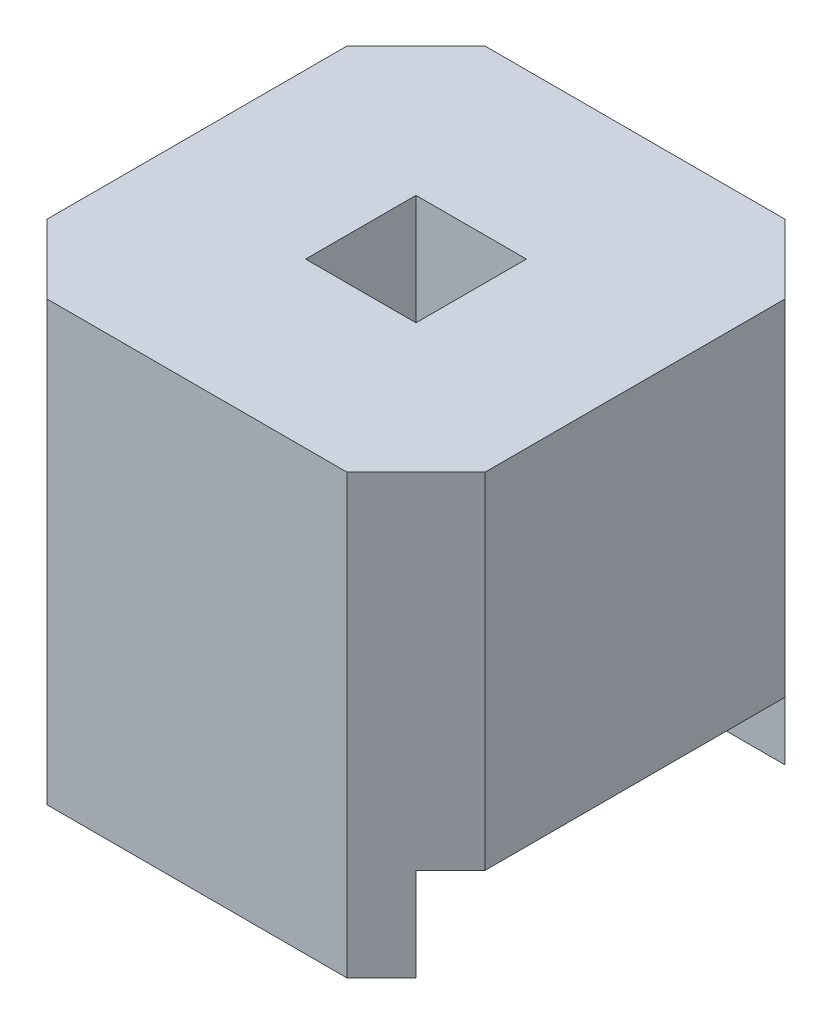
ISO-10303-21;
HEADER;
FILE_DESCRIPTION(('STEP AP214'),'2;1');
FILE_NAME('part.step','',(''),(''),'','','');
FILE_SCHEMA(('AUTOMOTIVE_DESIGN { 1 0 10303 214 1 1 1 1 }'));
ENDSEC;
DATA;
#1=APPLICATION_CONTEXT('core data for automotive mechanical design processes');
#2=APPLICATION_PROTOCOL_DEFINITION('international standard','automotive_design',2000,#1);
#3=PRODUCT_CONTEXT('',#1,'mechanical');
#4=PRODUCT('Part','Part','',(#3));
#5=PRODUCT_RELATED_PRODUCT_CATEGORY('part','',(#4));
#6=PRODUCT_DEFINITION_FORMATION('','',#4);
#7=PRODUCT_DEFINITION_CONTEXT('part definition',#1,'design');
#8=PRODUCT_DEFINITION('design','',#6,#7);
#9=PRODUCT_DEFINITION_SHAPE('','',#8);
#10=(LENGTH_UNIT() NAMED_UNIT(*) SI_UNIT(.MILLI.,.METRE.));
#11=(NAMED_UNIT(*) PLANE_ANGLE_UNIT() SI_UNIT($,.RADIAN.));
#12=(NAMED_UNIT(*) SI_UNIT($,.STERADIAN.) SOLID_ANGLE_UNIT());
#13=UNCERTAINTY_MEASURE_WITH_UNIT(LENGTH_MEASURE(1.E-05),#10,'distance_accuracy_value','');
#14=(GEOMETRIC_REPRESENTATION_CONTEXT(3) GLOBAL_UNCERTAINTY_ASSIGNED_CONTEXT((#13)) GLOBAL_UNIT_ASSIGNED_CONTEXT((#10,
#11,#12)) REPRESENTATION_CONTEXT('',''));
#15=CARTESIAN_POINT('',(0.,0.,0.));
#16=DIRECTION('',(0.,0.,1.));
#17=DIRECTION('',(1.,0.,0.));
#18=AXIS2_PLACEMENT_3D('',#15,#16,#17);
#19=CARTESIAN_POINT('',(-1.07,0.,-1.07));
#20=DIRECTION('',(0.,0.,-1.));
#21=DIRECTION('',(-1.,0.,0.));
#22=AXIS2_PLACEMENT_3D('',#19,#20,#21);
#23=PLANE('',#22);
#24=DIRECTION('',(1.,0.,0.));
#25=VECTOR('',#24,1.);
#26=CARTESIAN_POINT('',(0.,0.54,-1.07));
#27=LINE('',#26,#25);
#28=CARTESIAN_POINT('',(-1.07,0.54,-1.07));
#29=VERTEX_POINT('',#28);
#30=CARTESIAN_POINT('',(1.07,0.54,-1.07));
#31=VERTEX_POINT('',#30);
#32=EDGE_CURVE('E182',#29,#31,#27,.T.);
#33=ORIENTED_EDGE('',*,*,#32,.F.);
#34=DIRECTION('',(0.,1.,0.));
#35=VECTOR('',#34,1.);
#36=CARTESIAN_POINT('',(-1.07,1.27,-1.07));
#37=LINE('',#36,#35);
#38=CARTESIAN_POINT('',(-1.07,0.,-1.07));
#39=VERTEX_POINT('',#38);
#40=EDGE_CURVE('E173',#39,#29,#37,.T.);
#41=ORIENTED_EDGE('',*,*,#40,.F.);
#42=DIRECTION('',(1.,0.,0.));
#43=VECTOR('',#42,1.);
#44=CARTESIAN_POINT('',(0.,0.,-1.07));
#45=LINE('',#44,#43);
#46=CARTESIAN_POINT('',(1.07,0.,-1.07));
#47=VERTEX_POINT('',#46);
#48=EDGE_CURVE('E125',#39,#47,#45,.T.);
#49=ORIENTED_EDGE('',*,*,#48,.T.);
#50=DIRECTION('',(0.,1.,0.));
#51=VECTOR('',#50,1.);
#52=CARTESIAN_POINT('',(1.07,1.27,-1.07));
#53=LINE('',#52,#51);
#54=EDGE_CURVE('E148',#31,#47,#53,.F.);
#55=ORIENTED_EDGE('',*,*,#54,.F.);
#56=EDGE_LOOP('',(#33,#41,#49,#55));
#57=FACE_BOUND('',#56,.T.);
#58=ADVANCED_FACE('F17',(#57),#23,.F.);
#59=CARTESIAN_POINT('',(1.07,0.,1.07));
#60=DIRECTION('',(0.,0.,1.));
#61=DIRECTION('',(1.,0.,0.));
#62=AXIS2_PLACEMENT_3D('',#59,#60,#61);
#63=PLANE('',#62);
#64=DIRECTION('',(1.,0.,0.));
#65=VECTOR('',#64,1.);
#66=CARTESIAN_POINT('',(0.,0.54,1.07));
#67=LINE('',#66,#65);
#68=CARTESIAN_POINT('',(1.07,0.54,1.07));
#69=VERTEX_POINT('',#68);
#70=CARTESIAN_POINT('',(-1.07,0.54,1.07));
#71=VERTEX_POINT('',#70);
#72=EDGE_CURVE('E145',#69,#71,#67,.F.);
#73=ORIENTED_EDGE('',*,*,#72,.F.);
#74=DIRECTION('',(0.,1.,0.));
#75=VECTOR('',#74,1.);
#76=CARTESIAN_POINT('',(1.07,1.27,1.07));
#77=LINE('',#76,#75);
#78=CARTESIAN_POINT('',(1.07,0.,1.07));
#79=VERTEX_POINT('',#78);
#80=EDGE_CURVE('E142',#79,#69,#77,.T.);
#81=ORIENTED_EDGE('',*,*,#80,.F.);
#82=DIRECTION('',(1.,0.,0.));
#83=VECTOR('',#82,1.);
#84=CARTESIAN_POINT('',(0.,0.,1.07));
#85=LINE('',#84,#83);
#86=CARTESIAN_POINT('',(-1.07,0.,1.07));
#87=VERTEX_POINT('',#86);
#88=EDGE_CURVE('E130',#79,#87,#85,.F.);
#89=ORIENTED_EDGE('',*,*,#88,.T.);
#90=DIRECTION('',(0.,1.,0.));
#91=VECTOR('',#90,1.);
#92=CARTESIAN_POINT('',(-1.07,1.27,1.07));
#93=LINE('',#92,#91);
#94=EDGE_CURVE('E163',#71,#87,#93,.F.);
#95=ORIENTED_EDGE('',*,*,#94,.F.);
#96=EDGE_LOOP('',(#73,#81,#89,#95));
#97=FACE_BOUND('',#96,.T.);
#98=ADVANCED_FACE('F143',(#97),#63,.F.);
#99=CARTESIAN_POINT('',(0.32,2.54,0.32));
#100=DIRECTION('',(1.,0.,0.));
#101=DIRECTION('',(0.,0.,-1.));
#102=AXIS2_PLACEMENT_3D('',#99,#100,#101);
#103=PLANE('',#102);
#104=DIRECTION('',(0.,0.,-1.));
#105=VECTOR('',#104,1.);
#106=CARTESIAN_POINT('',(0.32,0.54,0.));
#107=LINE('',#106,#105);
#108=CARTESIAN_POINT('',(0.32,0.54,0.32));
#109=VERTEX_POINT('',#108);
#110=CARTESIAN_POINT('',(0.32,0.54,-0.32));
#111=VERTEX_POINT('',#110);
#112=EDGE_CURVE('E194',#109,#111,#107,.T.);
#113=ORIENTED_EDGE('',*,*,#112,.F.);
#114=DIRECTION('',(0.,1.,0.));
#115=VECTOR('',#114,1.);
#116=CARTESIAN_POINT('',(0.32,2.54,0.32));
#117=LINE('',#116,#115);
#118=CARTESIAN_POINT('',(0.32,2.54,0.32));
#119=VERTEX_POINT('',#118);
#120=EDGE_CURVE('E204',#109,#119,#117,.T.);
#121=ORIENTED_EDGE('',*,*,#120,.T.);
#122=DIRECTION('',(0.,0.,-1.));
#123=VECTOR('',#122,1.);
#124=CARTESIAN_POINT('',(0.32,2.54,0.32));
#125=LINE('',#124,#123);
#126=CARTESIAN_POINT('',(0.32,2.54,-0.32));
#127=VERTEX_POINT('',#126);
#128=EDGE_CURVE('E20',#127,#119,#125,.F.);
#129=ORIENTED_EDGE('',*,*,#128,.F.);
#130=DIRECTION('',(0.,1.,0.));
#131=VECTOR('',#130,1.);
#132=CARTESIAN_POINT('',(0.32,2.54,-0.32));
#133=LINE('',#132,#131);
#134=EDGE_CURVE('E177',#127,#111,#133,.F.);
#135=ORIENTED_EDGE('',*,*,#134,.T.);
#136=EDGE_LOOP('',(#113,#121,#129,#135));
#137=FACE_BOUND('',#136,.T.);
#138=ADVANCED_FACE('F329',(#137),#103,.F.);
#139=CARTESIAN_POINT('',(0.,0.,0.));
#140=DIRECTION('',(0.,1.,0.));
#141=DIRECTION('',(0.,0.,1.));
#142=AXIS2_PLACEMENT_3D('',#139,#140,#141);
#143=PLANE('',#142);
#144=DIRECTION('',(1.,0.,0.));
#145=VECTOR('',#144,1.);
#146=CARTESIAN_POINT('',(-1.27,0.,1.27));
#147=LINE('',#146,#145);
#148=CARTESIAN_POINT('',(-0.87,0.,1.27));
#149=VERTEX_POINT('',#148);
#150=CARTESIAN_POINT('',(0.87,0.,1.27));
#151=VERTEX_POINT('',#150);
#152=EDGE_CURVE('E207',#149,#151,#147,.T.);
#153=ORIENTED_EDGE('',*,*,#152,.F.);
#154=DIRECTION('',(0.707106781186548,0.,0.707106781186548));
#155=VECTOR('',#154,1.);
#156=CARTESIAN_POINT('',(-1.07,0.,1.07));
#157=LINE('',#156,#155);
#158=EDGE_CURVE('E137',#87,#149,#157,.T.);
#159=ORIENTED_EDGE('',*,*,#158,.F.);
#160=ORIENTED_EDGE('',*,*,#88,.F.);
#161=DIRECTION('',(0.707106781186548,0.,-0.707106781186548));
#162=VECTOR('',#161,1.);
#163=CARTESIAN_POINT('',(1.07,0.,1.07));
#164=LINE('',#163,#162);
#165=EDGE_CURVE('E134',#151,#79,#164,.T.);
#166=ORIENTED_EDGE('',*,*,#165,.F.);
#167=EDGE_LOOP('',(#153,#159,#160,#166));
#168=FACE_BOUND('',#167,.T.);
#169=ADVANCED_FACE('F132',(#168),#143,.F.);
#170=CARTESIAN_POINT('',(1.07,1.27,1.07));
#171=DIRECTION('',(0.707106781186548,0.,0.707106781186548));
#172=DIRECTION('',(0.707106781186548,0.,-0.707106781186548));
#173=AXIS2_PLACEMENT_3D('',#170,#171,#172);
#174=PLANE('',#173);
#175=ORIENTED_EDGE('',*,*,#80,.T.);
#176=DIRECTION('',(-0.707106781186548,0.,0.707106781186547));
#177=VECTOR('',#176,1.);
#178=CARTESIAN_POINT('',(1.27,0.54,0.87));
#179=LINE('',#178,#177);
#180=CARTESIAN_POINT('',(1.27,0.54,0.87));
#181=VERTEX_POINT('',#180);
#182=EDGE_CURVE('E188',#181,#69,#179,.T.);
#183=ORIENTED_EDGE('',*,*,#182,.F.);
#184=DIRECTION('',(0.,1.,0.));
#185=VECTOR('',#184,1.);
#186=CARTESIAN_POINT('',(1.27,0.,0.87));
#187=LINE('',#186,#185);
#188=CARTESIAN_POINT('',(1.27,2.54,0.87));
#189=VERTEX_POINT('',#188);
#190=EDGE_CURVE('E216',#189,#181,#187,.F.);
#191=ORIENTED_EDGE('',*,*,#190,.F.);
#192=DIRECTION('',(0.707106781186548,0.,-0.707106781186548));
#193=VECTOR('',#192,1.);
#194=CARTESIAN_POINT('',(1.07,2.54,1.07));
#195=LINE('',#194,#193);
#196=CARTESIAN_POINT('',(0.87,2.54,1.27));
#197=VERTEX_POINT('',#196);
#198=EDGE_CURVE('E140',#189,#197,#195,.F.);
#199=ORIENTED_EDGE('',*,*,#198,.T.);
#200=DIRECTION('',(0.,1.,0.));
#201=VECTOR('',#200,1.);
#202=CARTESIAN_POINT('',(0.87,0.,1.27));
#203=LINE('',#202,#201);
#204=EDGE_CURVE('E152',#151,#197,#203,.T.);
#205=ORIENTED_EDGE('',*,*,#204,.F.);
#206=ORIENTED_EDGE('',*,*,#165,.T.);
#207=EDGE_LOOP('',(#175,#183,#191,#199,#205,#206));
#208=FACE_BOUND('',#207,.T.);
#209=ADVANCED_FACE('F150',(#208),#174,.T.);
#210=CARTESIAN_POINT('',(1.07,1.27,-1.07));
#211=DIRECTION('',(0.707106781186548,0.,-0.707106781186548));
#212=DIRECTION('',(-0.707106781186548,0.,-0.707106781186548));
#213=AXIS2_PLACEMENT_3D('',#210,#211,#212);
#214=PLANE('',#213);
#215=DIRECTION('',(0.,1.,0.));
#216=VECTOR('',#215,1.);
#217=CARTESIAN_POINT('',(1.27,0.,-0.87));
#218=LINE('',#217,#216);
#219=CARTESIAN_POINT('',(1.27,0.54,-0.87));
#220=VERTEX_POINT('',#219);
#221=CARTESIAN_POINT('',(1.27,2.54,-0.87));
#222=VERTEX_POINT('',#221);
#223=EDGE_CURVE('E213',#220,#222,#218,.T.);
#224=ORIENTED_EDGE('',*,*,#223,.F.);
#225=DIRECTION('',(0.707106781186548,0.,0.707106781186547));
#226=VECTOR('',#225,1.);
#227=CARTESIAN_POINT('',(1.07,0.54,-1.07));
#228=LINE('',#227,#226);
#229=EDGE_CURVE('E185',#31,#220,#228,.T.);
#230=ORIENTED_EDGE('',*,*,#229,.F.);
#231=ORIENTED_EDGE('',*,*,#54,.T.);
#232=DIRECTION('',(-0.707106781186547,0.,-0.707106781186548));
#233=VECTOR('',#232,1.);
#234=CARTESIAN_POINT('',(1.07,0.,-1.07));
#235=LINE('',#234,#233);
#236=CARTESIAN_POINT('',(0.87,0.,-1.27));
#237=VERTEX_POINT('',#236);
#238=EDGE_CURVE('E161',#47,#237,#235,.T.);
#239=ORIENTED_EDGE('',*,*,#238,.T.);
#240=DIRECTION('',(0.,1.,0.));
#241=VECTOR('',#240,1.);
#242=CARTESIAN_POINT('',(0.87,0.,-1.27));
#243=LINE('',#242,#241);
#244=CARTESIAN_POINT('',(0.87,2.54,-1.27));
#245=VERTEX_POINT('',#244);
#246=EDGE_CURVE('E222',#245,#237,#243,.F.);
#247=ORIENTED_EDGE('',*,*,#246,.F.);
#248=DIRECTION('',(-0.707106781186548,0.,-0.707106781186548));
#249=VECTOR('',#248,1.);
#250=CARTESIAN_POINT('',(1.07,2.54,-1.07));
#251=LINE('',#250,#249);
#252=EDGE_CURVE('E158',#245,#222,#251,.F.);
#253=ORIENTED_EDGE('',*,*,#252,.T.);
#254=EDGE_LOOP('',(#224,#230,#231,#239,#247,#253));
#255=FACE_BOUND('',#254,.T.);
#256=ADVANCED_FACE('F316',(#255),#214,.T.);
#257=CARTESIAN_POINT('',(0.,0.,0.));
#258=DIRECTION('',(0.,1.,0.));
#259=DIRECTION('',(0.,0.,1.));
#260=AXIS2_PLACEMENT_3D('',#257,#258,#259);
#261=PLANE('',#260);
#262=DIRECTION('',(-1.,0.,0.));
#263=VECTOR('',#262,1.);
#264=CARTESIAN_POINT('',(1.27,0.,-1.27));
#265=LINE('',#264,#263);
#266=CARTESIAN_POINT('',(-0.87,0.,-1.27));
#267=VERTEX_POINT('',#266);
#268=EDGE_CURVE('E225',#237,#267,#265,.T.);
#269=ORIENTED_EDGE('',*,*,#268,.F.);
#270=ORIENTED_EDGE('',*,*,#238,.F.);
#271=ORIENTED_EDGE('',*,*,#48,.F.);
#272=DIRECTION('',(-0.707106781186548,0.,0.707106781186548));
#273=VECTOR('',#272,1.);
#274=CARTESIAN_POINT('',(-1.07,0.,-1.07));
#275=LINE('',#274,#273);
#276=EDGE_CURVE('E170',#267,#39,#275,.T.);
#277=ORIENTED_EDGE('',*,*,#276,.F.);
#278=EDGE_LOOP('',(#269,#270,#271,#277));
#279=FACE_BOUND('',#278,.T.);
#280=ADVANCED_FACE('F310',(#279),#261,.F.);
#281=CARTESIAN_POINT('',(-1.07,1.27,1.07));
#282=DIRECTION('',(-0.707106781186548,0.,0.707106781186548));
#283=DIRECTION('',(0.707106781186548,0.,0.707106781186548));
#284=AXIS2_PLACEMENT_3D('',#281,#282,#283);
#285=PLANE('',#284);
#286=DIRECTION('',(0.,1.,0.));
#287=VECTOR('',#286,1.);
#288=CARTESIAN_POINT('',(-1.27,0.,0.87));
#289=LINE('',#288,#287);
#290=CARTESIAN_POINT('',(-1.27,0.54,0.87));
#291=VERTEX_POINT('',#290);
#292=CARTESIAN_POINT('',(-1.27,2.54,0.87));
#293=VERTEX_POINT('',#292);
#294=EDGE_CURVE('E231',#291,#293,#289,.T.);
#295=ORIENTED_EDGE('',*,*,#294,.F.);
#296=DIRECTION('',(-0.707106781186548,0.,-0.707106781186547));
#297=VECTOR('',#296,1.);
#298=CARTESIAN_POINT('',(-1.07,0.54,1.07));
#299=LINE('',#298,#297);
#300=EDGE_CURVE('E191',#71,#291,#299,.T.);
#301=ORIENTED_EDGE('',*,*,#300,.F.);
#302=ORIENTED_EDGE('',*,*,#94,.T.);
#303=ORIENTED_EDGE('',*,*,#158,.T.);
#304=DIRECTION('',(0.,1.,0.));
#305=VECTOR('',#304,1.);
#306=CARTESIAN_POINT('',(-0.87,0.,1.27));
#307=LINE('',#306,#305);
#308=CARTESIAN_POINT('',(-0.87,2.54,1.27));
#309=VERTEX_POINT('',#308);
#310=EDGE_CURVE('E210',#309,#149,#307,.F.);
#311=ORIENTED_EDGE('',*,*,#310,.F.);
#312=DIRECTION('',(0.707106781186548,0.,0.707106781186548));
#313=VECTOR('',#312,1.);
#314=CARTESIAN_POINT('',(-1.07,2.54,1.07));
#315=LINE('',#314,#313);
#316=EDGE_CURVE('E166',#309,#293,#315,.F.);
#317=ORIENTED_EDGE('',*,*,#316,.T.);
#318=EDGE_LOOP('',(#295,#301,#302,#303,#311,#317));
#319=FACE_BOUND('',#318,.T.);
#320=ADVANCED_FACE('F266',(#319),#285,.T.);
#321=CARTESIAN_POINT('',(-1.07,1.27,-1.07));
#322=DIRECTION('',(-0.707106781186548,0.,-0.707106781186548));
#323=DIRECTION('',(-0.707106781186548,0.,0.707106781186548));
#324=AXIS2_PLACEMENT_3D('',#321,#322,#323);
#325=PLANE('',#324);
#326=ORIENTED_EDGE('',*,*,#40,.T.);
#327=DIRECTION('',(0.707106781186548,0.,-0.707106781186547));
#328=VECTOR('',#327,1.);
#329=CARTESIAN_POINT('',(-1.27,0.54,-0.87));
#330=LINE('',#329,#328);
#331=CARTESIAN_POINT('',(-1.27,0.54,-0.87));
#332=VERTEX_POINT('',#331);
#333=EDGE_CURVE('E179',#332,#29,#330,.T.);
#334=ORIENTED_EDGE('',*,*,#333,.F.);
#335=DIRECTION('',(0.,1.,0.));
#336=VECTOR('',#335,1.);
#337=CARTESIAN_POINT('',(-1.27,0.,-0.87));
#338=LINE('',#337,#336);
#339=CARTESIAN_POINT('',(-1.27,2.54,-0.87));
#340=VERTEX_POINT('',#339);
#341=EDGE_CURVE('E234',#340,#332,#338,.F.);
#342=ORIENTED_EDGE('',*,*,#341,.F.);
#343=DIRECTION('',(-0.707106781186548,0.,0.707106781186548));
#344=VECTOR('',#343,1.);
#345=CARTESIAN_POINT('',(-1.07,2.54,-1.07));
#346=LINE('',#345,#344);
#347=CARTESIAN_POINT('',(-0.87,2.54,-1.27));
#348=VERTEX_POINT('',#347);
#349=EDGE_CURVE('E168',#340,#348,#346,.F.);
#350=ORIENTED_EDGE('',*,*,#349,.T.);
#351=DIRECTION('',(0.,1.,0.));
#352=VECTOR('',#351,1.);
#353=CARTESIAN_POINT('',(-0.87,0.,-1.27));
#354=LINE('',#353,#352);
#355=EDGE_CURVE('E228',#267,#348,#354,.T.);
#356=ORIENTED_EDGE('',*,*,#355,.F.);
#357=ORIENTED_EDGE('',*,*,#276,.T.);
#358=EDGE_LOOP('',(#326,#334,#342,#350,#356,#357));
#359=FACE_BOUND('',#358,.T.);
#360=ADVANCED_FACE('F312',(#359),#325,.T.);
#361=CARTESIAN_POINT('',(0.32,2.54,-0.32));
#362=DIRECTION('',(0.,0.,-1.));
#363=DIRECTION('',(-1.,0.,0.));
#364=AXIS2_PLACEMENT_3D('',#361,#362,#363);
#365=PLANE('',#364);
#366=DIRECTION('',(1.,0.,0.));
#367=VECTOR('',#366,1.);
#368=CARTESIAN_POINT('',(0.,0.54,-0.32));
#369=LINE('',#368,#367);
#370=CARTESIAN_POINT('',(-0.32,0.54,-0.32));
#371=VERTEX_POINT('',#370);
#372=EDGE_CURVE('E197',#111,#371,#369,.F.);
#373=ORIENTED_EDGE('',*,*,#372,.F.);
#374=ORIENTED_EDGE('',*,*,#134,.F.);
#375=DIRECTION('',(-1.,0.,0.));
#376=VECTOR('',#375,1.);
#377=CARTESIAN_POINT('',(0.32,2.54,-0.32));
#378=LINE('',#377,#376);
#379=CARTESIAN_POINT('',(-0.32,2.54,-0.32));
#380=VERTEX_POINT('',#379);
#381=EDGE_CURVE('E175',#380,#127,#378,.F.);
#382=ORIENTED_EDGE('',*,*,#381,.F.);
#383=DIRECTION('',(0.,1.,0.));
#384=VECTOR('',#383,1.);
#385=CARTESIAN_POINT('',(-0.32,2.54,-0.32));
#386=LINE('',#385,#384);
#387=EDGE_CURVE('E240',#380,#371,#386,.F.);
#388=ORIENTED_EDGE('',*,*,#387,.T.);
#389=EDGE_LOOP('',(#373,#374,#382,#388));
#390=FACE_BOUND('',#389,.T.);
#391=ADVANCED_FACE('F391',(#390),#365,.F.);
#392=CARTESIAN_POINT('',(0.,0.54,0.));
#393=DIRECTION('',(0.,-1.,0.));
#394=DIRECTION('',(0.,0.,-1.));
#395=AXIS2_PLACEMENT_3D('',#392,#393,#394);
#396=PLANE('',#395);
#397=ORIENTED_EDGE('',*,*,#372,.T.);
#398=DIRECTION('',(0.,0.,1.));
#399=VECTOR('',#398,1.);
#400=CARTESIAN_POINT('',(-0.32,0.54,-0.32));
#401=LINE('',#400,#399);
#402=CARTESIAN_POINT('',(-0.32,0.54,0.32));
#403=VERTEX_POINT('',#402);
#404=EDGE_CURVE('E242',#371,#403,#401,.T.);
#405=ORIENTED_EDGE('',*,*,#404,.T.);
#406=DIRECTION('',(1.,0.,0.));
#407=VECTOR('',#406,1.);
#408=CARTESIAN_POINT('',(-0.32,0.54,0.32));
#409=LINE('',#408,#407);
#410=EDGE_CURVE('E201',#403,#109,#409,.T.);
#411=ORIENTED_EDGE('',*,*,#410,.T.);
#412=ORIENTED_EDGE('',*,*,#112,.T.);
#413=EDGE_LOOP('',(#397,#405,#411,#412));
#414=FACE_BOUND('',#413,.T.);
#415=ORIENTED_EDGE('',*,*,#300,.T.);
#416=DIRECTION('',(0.,0.,1.));
#417=VECTOR('',#416,1.);
#418=CARTESIAN_POINT('',(-1.27,0.54,-1.27));
#419=LINE('',#418,#417);
#420=EDGE_CURVE('E237',#332,#291,#419,.T.);
#421=ORIENTED_EDGE('',*,*,#420,.F.);
#422=ORIENTED_EDGE('',*,*,#333,.T.);
#423=ORIENTED_EDGE('',*,*,#32,.T.);
#424=ORIENTED_EDGE('',*,*,#229,.T.);
#425=DIRECTION('',(0.,0.,-1.));
#426=VECTOR('',#425,1.);
#427=CARTESIAN_POINT('',(1.27,0.54,1.27));
#428=LINE('',#427,#426);
#429=EDGE_CURVE('E219',#181,#220,#428,.T.);
#430=ORIENTED_EDGE('',*,*,#429,.F.);
#431=ORIENTED_EDGE('',*,*,#182,.T.);
#432=ORIENTED_EDGE('',*,*,#72,.T.);
#433=EDGE_LOOP('',(#415,#421,#422,#423,#424,#430,#431,#432));
#434=FACE_BOUND('',#433,.T.);
#435=ADVANCED_FACE('F268',(#414,#434),#396,.T.);
#436=CARTESIAN_POINT('',(-0.32,2.54,0.32));
#437=DIRECTION('',(0.,0.,1.));
#438=DIRECTION('',(1.,0.,0.));
#439=AXIS2_PLACEMENT_3D('',#436,#437,#438);
#440=PLANE('',#439);
#441=ORIENTED_EDGE('',*,*,#410,.F.);
#442=DIRECTION('',(0.,1.,0.));
#443=VECTOR('',#442,1.);
#444=CARTESIAN_POINT('',(-0.32,2.54,0.32));
#445=LINE('',#444,#443);
#446=CARTESIAN_POINT('',(-0.32,2.54,0.32));
#447=VERTEX_POINT('',#446);
#448=EDGE_CURVE('E244',#403,#447,#445,.T.);
#449=ORIENTED_EDGE('',*,*,#448,.T.);
#450=DIRECTION('',(1.,0.,0.));
#451=VECTOR('',#450,1.);
#452=CARTESIAN_POINT('',(-0.32,2.54,0.32));
#453=LINE('',#452,#451);
#454=EDGE_CURVE('E34',#119,#447,#453,.F.);
#455=ORIENTED_EDGE('',*,*,#454,.F.);
#456=ORIENTED_EDGE('',*,*,#120,.F.);
#457=EDGE_LOOP('',(#441,#449,#455,#456));
#458=FACE_BOUND('',#457,.T.);
#459=ADVANCED_FACE('F279',(#458),#440,.F.);
#460=CARTESIAN_POINT('',(-1.27,0.,1.27));
#461=DIRECTION('',(0.,0.,1.));
#462=DIRECTION('',(1.,0.,0.));
#463=AXIS2_PLACEMENT_3D('',#460,#461,#462);
#464=PLANE('',#463);
#465=DIRECTION('',(1.,0.,0.));
#466=VECTOR('',#465,1.);
#467=CARTESIAN_POINT('',(0.,2.54,1.27));
#468=LINE('',#467,#466);
#469=EDGE_CURVE('E246',#309,#197,#468,.T.);
#470=ORIENTED_EDGE('',*,*,#469,.F.);
#471=ORIENTED_EDGE('',*,*,#310,.T.);
#472=ORIENTED_EDGE('',*,*,#152,.T.);
#473=ORIENTED_EDGE('',*,*,#204,.T.);
#474=EDGE_LOOP('',(#470,#471,#472,#473));
#475=FACE_BOUND('',#474,.T.);
#476=ADVANCED_FACE('F277',(#475),#464,.T.);
#477=CARTESIAN_POINT('',(1.27,0.,1.27));
#478=DIRECTION('',(1.,0.,0.));
#479=DIRECTION('',(0.,0.,-1.));
#480=AXIS2_PLACEMENT_3D('',#477,#478,#479);
#481=PLANE('',#480);
#482=ORIENTED_EDGE('',*,*,#190,.T.);
#483=ORIENTED_EDGE('',*,*,#429,.T.);
#484=ORIENTED_EDGE('',*,*,#223,.T.);
#485=DIRECTION('',(0.,0.,1.));
#486=VECTOR('',#485,1.);
#487=CARTESIAN_POINT('',(1.27,2.54,0.));
#488=LINE('',#487,#486);
#489=EDGE_CURVE('E249',#189,#222,#488,.F.);
#490=ORIENTED_EDGE('',*,*,#489,.F.);
#491=EDGE_LOOP('',(#482,#483,#484,#490));
#492=FACE_BOUND('',#491,.T.);
#493=ADVANCED_FACE('F273',(#492),#481,.T.);
#494=CARTESIAN_POINT('',(1.27,0.,-1.27));
#495=DIRECTION('',(0.,0.,-1.));
#496=DIRECTION('',(-1.,0.,0.));
#497=AXIS2_PLACEMENT_3D('',#494,#495,#496);
#498=PLANE('',#497);
#499=ORIENTED_EDGE('',*,*,#268,.T.);
#500=ORIENTED_EDGE('',*,*,#355,.T.);
#501=DIRECTION('',(1.,0.,0.));
#502=VECTOR('',#501,1.);
#503=CARTESIAN_POINT('',(0.,2.54,-1.27));
#504=LINE('',#503,#502);
#505=EDGE_CURVE('E252',#245,#348,#504,.F.);
#506=ORIENTED_EDGE('',*,*,#505,.F.);
#507=ORIENTED_EDGE('',*,*,#246,.T.);
#508=EDGE_LOOP('',(#499,#500,#506,#507));
#509=FACE_BOUND('',#508,.T.);
#510=ADVANCED_FACE('F286',(#509),#498,.T.);
#511=CARTESIAN_POINT('',(-1.27,0.,-1.27));
#512=DIRECTION('',(-1.,0.,0.));
#513=DIRECTION('',(0.,0.,1.));
#514=AXIS2_PLACEMENT_3D('',#511,#512,#513);
#515=PLANE('',#514);
#516=ORIENTED_EDGE('',*,*,#341,.T.);
#517=ORIENTED_EDGE('',*,*,#420,.T.);
#518=ORIENTED_EDGE('',*,*,#294,.T.);
#519=DIRECTION('',(0.,0.,1.));
#520=VECTOR('',#519,1.);
#521=CARTESIAN_POINT('',(-1.27,2.54,0.));
#522=LINE('',#521,#520);
#523=EDGE_CURVE('E26',#340,#293,#522,.T.);
#524=ORIENTED_EDGE('',*,*,#523,.F.);
#525=EDGE_LOOP('',(#516,#517,#518,#524));
#526=FACE_BOUND('',#525,.T.);
#527=ADVANCED_FACE('F262',(#526),#515,.T.);
#528=CARTESIAN_POINT('',(-0.32,2.54,-0.32));
#529=DIRECTION('',(-1.,0.,0.));
#530=DIRECTION('',(0.,0.,1.));
#531=AXIS2_PLACEMENT_3D('',#528,#529,#530);
#532=PLANE('',#531);
#533=ORIENTED_EDGE('',*,*,#404,.F.);
#534=ORIENTED_EDGE('',*,*,#387,.F.);
#535=DIRECTION('',(0.,0.,1.));
#536=VECTOR('',#535,1.);
#537=CARTESIAN_POINT('',(-0.32,2.54,0.));
#538=LINE('',#537,#536);
#539=EDGE_CURVE('E11',#447,#380,#538,.F.);
#540=ORIENTED_EDGE('',*,*,#539,.F.);
#541=ORIENTED_EDGE('',*,*,#448,.F.);
#542=EDGE_LOOP('',(#533,#534,#540,#541));
#543=FACE_BOUND('',#542,.T.);
#544=ADVANCED_FACE('F291',(#543),#532,.F.);
#545=CARTESIAN_POINT('',(0.,2.54,0.));
#546=DIRECTION('',(0.,1.,0.));
#547=DIRECTION('',(0.,0.,1.));
#548=AXIS2_PLACEMENT_3D('',#545,#546,#547);
#549=PLANE('',#548);
#550=ORIENTED_EDGE('',*,*,#454,.T.);
#551=ORIENTED_EDGE('',*,*,#539,.T.);
#552=ORIENTED_EDGE('',*,*,#381,.T.);
#553=ORIENTED_EDGE('',*,*,#128,.T.);
#554=EDGE_LOOP('',(#550,#551,#552,#553));
#555=FACE_BOUND('',#554,.T.);
#556=ORIENTED_EDGE('',*,*,#523,.T.);
#557=ORIENTED_EDGE('',*,*,#316,.F.);
#558=ORIENTED_EDGE('',*,*,#469,.T.);
#559=ORIENTED_EDGE('',*,*,#198,.F.);
#560=ORIENTED_EDGE('',*,*,#489,.T.);
#561=ORIENTED_EDGE('',*,*,#252,.F.);
#562=ORIENTED_EDGE('',*,*,#505,.T.);
#563=ORIENTED_EDGE('',*,*,#349,.F.);
#564=EDGE_LOOP('',(#556,#557,#558,#559,#560,#561,#562,#563));
#565=FACE_BOUND('',#564,.T.);
#566=ADVANCED_FACE('F258',(#555,#565),#549,.T.);
#567=CLOSED_SHELL('',(#58,#98,#138,#169,#209,#256,#280,#320,#360,#391,#435,#459,#476,#493,#510,
#527,#544,#566));
#568=MANIFOLD_SOLID_BREP('B1',#567);
#569=ADVANCED_BREP_SHAPE_REPRESENTATION('',(#18,#568),#14);
#570=SHAPE_DEFINITION_REPRESENTATION(#9,#569);
ENDSEC;
END-ISO-10303-21;
